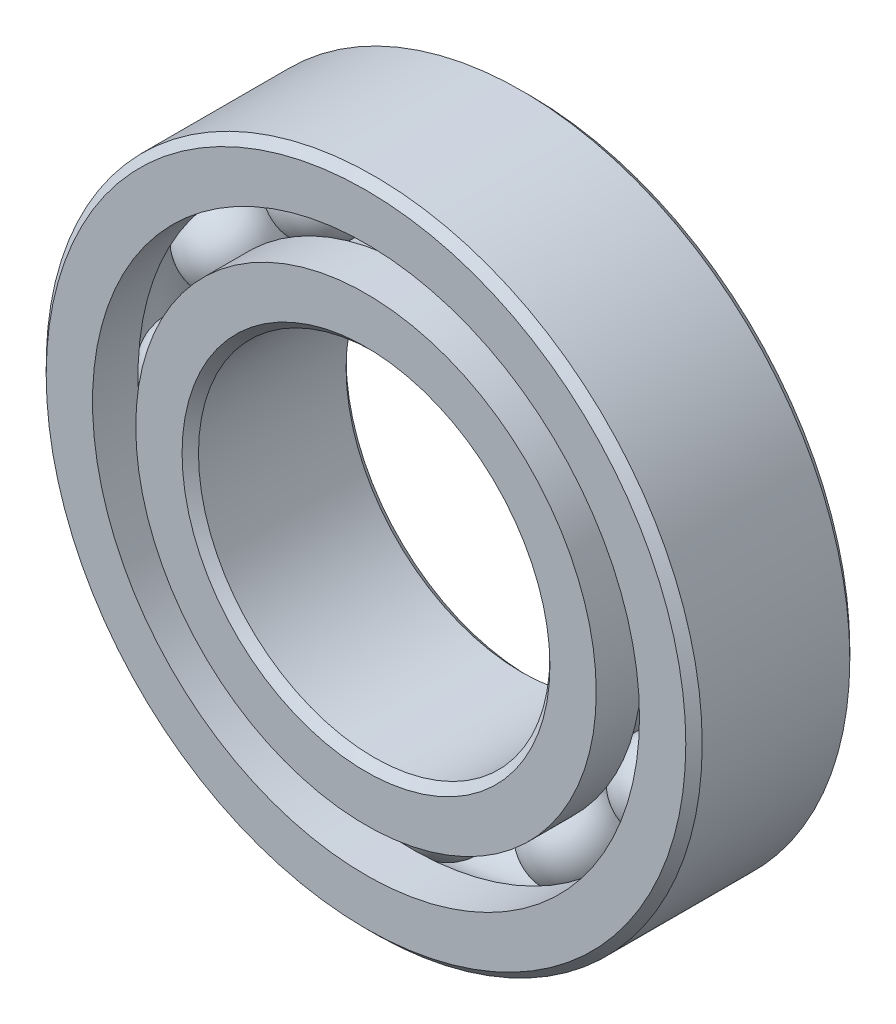
ISO-10303-21;
HEADER;
FILE_DESCRIPTION(('STEP AP214'),'2;1');
FILE_NAME('part.step','',(''),(''),'','','');
FILE_SCHEMA(('AUTOMOTIVE_DESIGN { 1 0 10303 214 1 1 1 1 }'));
ENDSEC;
DATA;
#1=APPLICATION_CONTEXT('core data for automotive mechanical design processes');
#2=APPLICATION_PROTOCOL_DEFINITION('international standard','automotive_design',2000,#1);
#3=PRODUCT_CONTEXT('',#1,'mechanical');
#4=PRODUCT('Part','Part','',(#3));
#5=PRODUCT_RELATED_PRODUCT_CATEGORY('part','',(#4));
#6=PRODUCT_DEFINITION_FORMATION('','',#4);
#7=PRODUCT_DEFINITION_CONTEXT('part definition',#1,'design');
#8=PRODUCT_DEFINITION('design','',#6,#7);
#9=PRODUCT_DEFINITION_SHAPE('','',#8);
#10=(LENGTH_UNIT() NAMED_UNIT(*) SI_UNIT(.MILLI.,.METRE.));
#11=(NAMED_UNIT(*) PLANE_ANGLE_UNIT() SI_UNIT($,.RADIAN.));
#12=(NAMED_UNIT(*) SI_UNIT($,.STERADIAN.) SOLID_ANGLE_UNIT());
#13=UNCERTAINTY_MEASURE_WITH_UNIT(LENGTH_MEASURE(1.E-05),#10,'distance_accuracy_value','');
#14=(GEOMETRIC_REPRESENTATION_CONTEXT(3) GLOBAL_UNCERTAINTY_ASSIGNED_CONTEXT((#13)) GLOBAL_UNIT_ASSIGNED_CONTEXT((#10,
#11,#12)) REPRESENTATION_CONTEXT('',''));
#15=CARTESIAN_POINT('',(0.,0.,0.));
#16=DIRECTION('',(0.,0.,1.));
#17=DIRECTION('',(1.,0.,0.));
#18=AXIS2_PLACEMENT_3D('',#15,#16,#17);
#19=CARTESIAN_POINT('',(-5.37499999999988,9.30977309068278,0.));
#20=DIRECTION('',(0.,0.,1.));
#21=DIRECTION('',(-0.499999999999989,0.866025403784445,0.));
#22=AXIS2_PLACEMENT_3D('',#19,#20,#21);
#23=SPHERICAL_SURFACE('',#22,1.80881842436904);
#24=CARTESIAN_POINT('',(-5.37499999999988,9.30977309068278,1.80881842436904));
#25=VERTEX_POINT('',#24);
#26=VERTEX_LOOP('',#25);
#27=FACE_BOUND('',#26,.T.);
#28=ADVANCED_FACE('F37',(#27),#23,.T.);
#29=CLOSED_SHELL('',(#28));
#30=MANIFOLD_SOLID_BREP('B2',#29);
#31=CARTESIAN_POINT('',(-9.30977309068265,5.37500000000011,0.));
#32=DIRECTION('',(0.,0.,1.));
#33=DIRECTION('',(-0.866025403784433,0.50000000000001,0.));
#34=AXIS2_PLACEMENT_3D('',#31,#32,#33);
#35=SPHERICAL_SURFACE('',#34,1.80881842436904);
#36=CARTESIAN_POINT('',(-9.30977309068265,5.37500000000011,1.80881842436904));
#37=VERTEX_POINT('',#36);
#38=VERTEX_LOOP('',#37);
#39=FACE_BOUND('',#38,.T.);
#40=ADVANCED_FACE('F57',(#39),#35,.T.);
#41=CLOSED_SHELL('',(#40));
#42=MANIFOLD_SOLID_BREP('B6',#41);
#43=CARTESIAN_POINT('',(-10.75,1.12600273177691E-13,0.));
#44=DIRECTION('',(0.,0.,1.));
#45=DIRECTION('',(-1.,0.,0.));
#46=AXIS2_PLACEMENT_3D('',#43,#44,#45);
#47=SPHERICAL_SURFACE('',#46,1.80881842436904);
#48=CARTESIAN_POINT('',(-10.75,1.12600273177691E-13,1.80881842436904));
#49=VERTEX_POINT('',#48);
#50=VERTEX_LOOP('',#49);
#51=FACE_BOUND('',#50,.T.);
#52=ADVANCED_FACE('F77',(#51),#47,.T.);
#53=CLOSED_SHELL('',(#52));
#54=MANIFOLD_SOLID_BREP('B33',#53);
#55=CARTESIAN_POINT('',(-9.30977309068276,-5.37499999999991,0.));
#56=DIRECTION('',(0.,0.,1.));
#57=DIRECTION('',(-0.866025403784443,-0.499999999999992,0.));
#58=AXIS2_PLACEMENT_3D('',#55,#56,#57);
#59=SPHERICAL_SURFACE('',#58,1.80881842436904);
#60=CARTESIAN_POINT('',(-9.30977309068276,-5.37499999999991,1.80881842436904));
#61=VERTEX_POINT('',#60);
#62=VERTEX_LOOP('',#61);
#63=FACE_BOUND('',#62,.T.);
#64=ADVANCED_FACE('F97',(#63),#59,.T.);
#65=CLOSED_SHELL('',(#64));
#66=MANIFOLD_SOLID_BREP('B53',#65);
#67=CARTESIAN_POINT('',(-5.37500000000008,-9.30977309068267,0.));
#68=DIRECTION('',(0.,0.,1.));
#69=DIRECTION('',(-0.500000000000007,-0.866025403784435,0.));
#70=AXIS2_PLACEMENT_3D('',#67,#68,#69);
#71=SPHERICAL_SURFACE('',#70,1.80881842436904);
#72=CARTESIAN_POINT('',(-5.37500000000008,-9.30977309068267,1.80881842436904));
#73=VERTEX_POINT('',#72);
#74=VERTEX_LOOP('',#73);
#75=FACE_BOUND('',#74,.T.);
#76=ADVANCED_FACE('F117',(#75),#71,.T.);
#77=CLOSED_SHELL('',(#76));
#78=MANIFOLD_SOLID_BREP('B73',#77);
#79=CARTESIAN_POINT('',(0.,-10.75,0.));
#80=DIRECTION('',(0.,0.,1.));
#81=DIRECTION('',(0.,-1.,0.));
#82=AXIS2_PLACEMENT_3D('',#79,#80,#81);
#83=SPHERICAL_SURFACE('',#82,1.80881842436904);
#84=CARTESIAN_POINT('',(0.,-10.75,1.80881842436904));
#85=VERTEX_POINT('',#84);
#86=VERTEX_LOOP('',#85);
#87=FACE_BOUND('',#86,.T.);
#88=ADVANCED_FACE('F137',(#87),#83,.T.);
#89=CLOSED_SHELL('',(#88));
#90=MANIFOLD_SOLID_BREP('B93',#89);
#91=CARTESIAN_POINT('',(5.37499999999994,-9.30977309068275,0.));
#92=DIRECTION('',(0.,0.,1.));
#93=DIRECTION('',(0.499999999999995,-0.866025403784442,0.));
#94=AXIS2_PLACEMENT_3D('',#91,#92,#93);
#95=SPHERICAL_SURFACE('',#94,1.80881842436904);
#96=CARTESIAN_POINT('',(5.37499999999994,-9.30977309068275,1.80881842436904));
#97=VERTEX_POINT('',#96);
#98=VERTEX_LOOP('',#97);
#99=FACE_BOUND('',#98,.T.);
#100=ADVANCED_FACE('F157',(#99),#95,.T.);
#101=CLOSED_SHELL('',(#100));
#102=MANIFOLD_SOLID_BREP('B113',#101);
#103=CARTESIAN_POINT('',(9.30977309068269,-5.37500000000004,0.));
#104=DIRECTION('',(0.,0.,1.));
#105=DIRECTION('',(0.866025403784436,-0.500000000000004,0.));
#106=AXIS2_PLACEMENT_3D('',#103,#104,#105);
#107=SPHERICAL_SURFACE('',#106,1.80881842436904);
#108=CARTESIAN_POINT('',(9.30977309068269,-5.37500000000004,1.80881842436904));
#109=VERTEX_POINT('',#108);
#110=VERTEX_LOOP('',#109);
#111=FACE_BOUND('',#110,.T.);
#112=ADVANCED_FACE('F177',(#111),#107,.T.);
#113=CLOSED_SHELL('',(#112));
#114=MANIFOLD_SOLID_BREP('B133',#113);
#115=CARTESIAN_POINT('',(10.75,0.,0.));
#116=DIRECTION('',(0.,0.,1.));
#117=DIRECTION('',(1.,0.,0.));
#118=AXIS2_PLACEMENT_3D('',#115,#116,#117);
#119=SPHERICAL_SURFACE('',#118,1.80881842436904);
#120=CARTESIAN_POINT('',(10.75,0.,1.80881842436904));
#121=VERTEX_POINT('',#120);
#122=VERTEX_LOOP('',#121);
#123=FACE_BOUND('',#122,.T.);
#124=ADVANCED_FACE('F197',(#123),#119,.T.);
#125=CLOSED_SHELL('',(#124));
#126=MANIFOLD_SOLID_BREP('B153',#125);
#127=CARTESIAN_POINT('',(9.30977309068273,5.37499999999998,0.));
#128=DIRECTION('',(0.,0.,1.));
#129=DIRECTION('',(0.86602540378444,0.499999999999998,0.));
#130=AXIS2_PLACEMENT_3D('',#127,#128,#129);
#131=SPHERICAL_SURFACE('',#130,1.80881842436904);
#132=CARTESIAN_POINT('',(9.30977309068273,5.37499999999998,1.80881842436904));
#133=VERTEX_POINT('',#132);
#134=VERTEX_LOOP('',#133);
#135=FACE_BOUND('',#134,.T.);
#136=ADVANCED_FACE('F217',(#135),#131,.T.);
#137=CLOSED_SHELL('',(#136));
#138=MANIFOLD_SOLID_BREP('B173',#137);
#139=CARTESIAN_POINT('',(5.37500000000001,9.30977309068271,0.));
#140=DIRECTION('',(0.,0.,1.));
#141=DIRECTION('',(0.500000000000001,0.866025403784438,0.));
#142=AXIS2_PLACEMENT_3D('',#139,#140,#141);
#143=SPHERICAL_SURFACE('',#142,1.80881842436904);
#144=CARTESIAN_POINT('',(5.37500000000001,9.30977309068271,1.80881842436904));
#145=VERTEX_POINT('',#144);
#146=VERTEX_LOOP('',#145);
#147=FACE_BOUND('',#146,.T.);
#148=ADVANCED_FACE('F237',(#147),#143,.T.);
#149=CLOSED_SHELL('',(#148));
#150=MANIFOLD_SOLID_BREP('B193',#149);
#151=CARTESIAN_POINT('',(0.,10.75,0.));
#152=DIRECTION('',(0.,0.,1.));
#153=DIRECTION('',(0.,1.,0.));
#154=AXIS2_PLACEMENT_3D('',#151,#152,#153);
#155=SPHERICAL_SURFACE('',#154,1.80881842436904);
#156=CARTESIAN_POINT('',(0.,10.75,1.80881842436904));
#157=VERTEX_POINT('',#156);
#158=VERTEX_LOOP('',#157);
#159=FACE_BOUND('',#158,.T.);
#160=ADVANCED_FACE('F259',(#159),#155,.T.);
#161=CLOSED_SHELL('',(#160));
#162=MANIFOLD_SOLID_BREP('B213',#161);
#163=CARTESIAN_POINT('',(0.,9.82692307692308,3.5));
#164=DIRECTION('',(0.,0.,-1.));
#165=DIRECTION('',(-1.,0.,0.));
#166=AXIS2_PLACEMENT_3D('',#163,#164,#165);
#167=PLANE('',#166);
#168=CARTESIAN_POINT('',(0.,0.,3.5));
#169=DIRECTION('',(0.,0.,1.));
#170=DIRECTION('',(1.,0.,0.));
#171=AXIS2_PLACEMENT_3D('',#168,#169,#170);
#172=CIRCLE('',#171,7.85);
#173=CARTESIAN_POINT('',(7.85,0.,3.5));
#174=VERTEX_POINT('',#173);
#175=EDGE_CURVE('E306',#174,#174,#172,.T.);
#176=ORIENTED_EDGE('',*,*,#175,.F.);
#177=EDGE_LOOP('',(#176));
#178=FACE_BOUND('',#177,.T.);
#179=CARTESIAN_POINT('',(0.,0.,3.5));
#180=DIRECTION('',(0.,0.,1.));
#181=DIRECTION('',(1.,0.,0.));
#182=AXIS2_PLACEMENT_3D('',#179,#180,#181);
#183=CIRCLE('',#182,9.82692307692308);
#184=CARTESIAN_POINT('',(9.82692307692308,0.,3.5));
#185=VERTEX_POINT('',#184);
#186=EDGE_CURVE('E258',#185,#185,#183,.T.);
#187=ORIENTED_EDGE('',*,*,#186,.T.);
#188=EDGE_LOOP('',(#187));
#189=FACE_BOUND('',#188,.T.);
#190=ADVANCED_FACE('F278',(#178,#189),#167,.F.);
#191=CARTESIAN_POINT('',(0.,0.,3.5));
#192=DIRECTION('',(0.,0.,1.));
#193=DIRECTION('',(1.,0.,0.));
#194=AXIS2_PLACEMENT_3D('',#191,#192,#193);
#195=CYLINDRICAL_SURFACE('',#194,9.82692307692308);
#196=ORIENTED_EDGE('',*,*,#186,.F.);
#197=EDGE_LOOP('',(#196));
#198=FACE_BOUND('',#197,.T.);
#199=CARTESIAN_POINT('',(0.,0.,1.55555555555556));
#200=DIRECTION('',(0.,0.,1.));
#201=DIRECTION('',(1.,0.,0.));
#202=AXIS2_PLACEMENT_3D('',#199,#200,#201);
#203=CIRCLE('',#202,9.82692307692308);
#204=CARTESIAN_POINT('',(9.82692307692308,0.,1.55555555555556));
#205=VERTEX_POINT('',#204);
#206=EDGE_CURVE('E284',#205,#205,#203,.T.);
#207=ORIENTED_EDGE('',*,*,#206,.T.);
#208=EDGE_LOOP('',(#207));
#209=FACE_BOUND('',#208,.T.);
#210=ADVANCED_FACE('F313',(#198,#209),#195,.T.);
#211=CARTESIAN_POINT('',(0.,0.,0.));
#212=DIRECTION('',(0.,0.,1.));
#213=DIRECTION('',(1.,0.,0.));
#214=AXIS2_PLACEMENT_3D('',#211,#212,#213);
#215=TOROIDAL_SURFACE('',#214,10.75,1.80881842436904);
#216=ORIENTED_EDGE('',*,*,#206,.F.);
#217=EDGE_LOOP('',(#216));
#218=FACE_BOUND('',#217,.T.);
#219=CARTESIAN_POINT('',(0.,0.,-1.55555555555556));
#220=DIRECTION('',(0.,0.,1.));
#221=DIRECTION('',(1.,0.,0.));
#222=AXIS2_PLACEMENT_3D('',#219,#220,#221);
#223=CIRCLE('',#222,9.82692307692308);
#224=CARTESIAN_POINT('',(9.82692307692308,0.,-1.55555555555556));
#225=VERTEX_POINT('',#224);
#226=EDGE_CURVE('E288',#225,#225,#223,.T.);
#227=ORIENTED_EDGE('',*,*,#226,.T.);
#228=EDGE_LOOP('',(#227));
#229=FACE_BOUND('',#228,.T.);
#230=ADVANCED_FACE('F317',(#218,#229),#215,.F.);
#231=CARTESIAN_POINT('',(0.,0.,3.5));
#232=DIRECTION('',(0.,0.,1.));
#233=DIRECTION('',(1.,0.,0.));
#234=AXIS2_PLACEMENT_3D('',#231,#232,#233);
#235=CYLINDRICAL_SURFACE('',#234,9.82692307692308);
#236=ORIENTED_EDGE('',*,*,#226,.F.);
#237=EDGE_LOOP('',(#236));
#238=FACE_BOUND('',#237,.T.);
#239=CARTESIAN_POINT('',(0.,0.,-3.5));
#240=DIRECTION('',(0.,0.,1.));
#241=DIRECTION('',(1.,0.,0.));
#242=AXIS2_PLACEMENT_3D('',#239,#240,#241);
#243=CIRCLE('',#242,9.82692307692308);
#244=CARTESIAN_POINT('',(9.82692307692308,0.,-3.5));
#245=VERTEX_POINT('',#244);
#246=EDGE_CURVE('E292',#245,#245,#243,.T.);
#247=ORIENTED_EDGE('',*,*,#246,.T.);
#248=EDGE_LOOP('',(#247));
#249=FACE_BOUND('',#248,.T.);
#250=ADVANCED_FACE('F322',(#238,#249),#235,.T.);
#251=CARTESIAN_POINT('',(0.,7.85,-3.5));
#252=DIRECTION('',(0.,0.,1.));
#253=DIRECTION('',(1.,0.,0.));
#254=AXIS2_PLACEMENT_3D('',#251,#252,#253);
#255=PLANE('',#254);
#256=ORIENTED_EDGE('',*,*,#246,.F.);
#257=EDGE_LOOP('',(#256));
#258=FACE_BOUND('',#257,.T.);
#259=CARTESIAN_POINT('',(0.,0.,-3.5));
#260=DIRECTION('',(0.,0.,1.));
#261=DIRECTION('',(1.,0.,0.));
#262=AXIS2_PLACEMENT_3D('',#259,#260,#261);
#263=CIRCLE('',#262,7.85);
#264=CARTESIAN_POINT('',(7.85,0.,-3.5));
#265=VERTEX_POINT('',#264);
#266=EDGE_CURVE('E297',#265,#265,#263,.T.);
#267=ORIENTED_EDGE('',*,*,#266,.T.);
#268=EDGE_LOOP('',(#267));
#269=FACE_BOUND('',#268,.T.);
#270=ADVANCED_FACE('F328',(#258,#269),#255,.F.);
#271=CARTESIAN_POINT('',(0.,0.,-3.15));
#272=DIRECTION('',(0.,0.,-1.));
#273=DIRECTION('',(-1.,0.,0.));
#274=AXIS2_PLACEMENT_3D('',#271,#272,#273);
#275=CONICAL_SURFACE('',#274,7.5,0.785398163397437);
#276=ORIENTED_EDGE('',*,*,#266,.F.);
#277=EDGE_LOOP('',(#276));
#278=FACE_BOUND('',#277,.T.);
#279=CARTESIAN_POINT('',(0.,0.,-3.15));
#280=DIRECTION('',(0.,0.,1.));
#281=DIRECTION('',(1.,0.,0.));
#282=AXIS2_PLACEMENT_3D('',#279,#280,#281);
#283=CIRCLE('',#282,7.5);
#284=CARTESIAN_POINT('',(7.5,0.,-3.15));
#285=VERTEX_POINT('',#284);
#286=EDGE_CURVE('E300',#285,#285,#283,.T.);
#287=ORIENTED_EDGE('',*,*,#286,.T.);
#288=EDGE_LOOP('',(#287));
#289=FACE_BOUND('',#288,.T.);
#290=ADVANCED_FACE('F332',(#278,#289),#275,.F.);
#291=CARTESIAN_POINT('',(0.,0.,3.5));
#292=DIRECTION('',(0.,0.,1.));
#293=DIRECTION('',(1.,0.,0.));
#294=AXIS2_PLACEMENT_3D('',#291,#292,#293);
#295=CYLINDRICAL_SURFACE('',#294,7.5);
#296=ORIENTED_EDGE('',*,*,#286,.F.);
#297=EDGE_LOOP('',(#296));
#298=FACE_BOUND('',#297,.T.);
#299=CARTESIAN_POINT('',(0.,0.,3.15000000000001));
#300=DIRECTION('',(0.,0.,1.));
#301=DIRECTION('',(1.,0.,0.));
#302=AXIS2_PLACEMENT_3D('',#299,#300,#301);
#303=CIRCLE('',#302,7.5);
#304=CARTESIAN_POINT('',(7.5,0.,3.15000000000001));
#305=VERTEX_POINT('',#304);
#306=EDGE_CURVE('E303',#305,#305,#303,.T.);
#307=ORIENTED_EDGE('',*,*,#306,.T.);
#308=EDGE_LOOP('',(#307));
#309=FACE_BOUND('',#308,.T.);
#310=ADVANCED_FACE('F336',(#298,#309),#295,.F.);
#311=CARTESIAN_POINT('',(0.,0.,3.5));
#312=DIRECTION('',(0.,0.,1.));
#313=DIRECTION('',(1.,0.,0.));
#314=AXIS2_PLACEMENT_3D('',#311,#312,#313);
#315=CONICAL_SURFACE('',#314,7.85,0.785398163397456);
#316=ORIENTED_EDGE('',*,*,#306,.F.);
#317=EDGE_LOOP('',(#316));
#318=FACE_BOUND('',#317,.T.);
#319=ORIENTED_EDGE('',*,*,#175,.T.);
#320=EDGE_LOOP('',(#319));
#321=FACE_BOUND('',#320,.T.);
#322=ADVANCED_FACE('F310',(#318,#321),#315,.F.);
#323=CLOSED_SHELL('',(#190,#210,#230,#250,#270,#290,#310,#322));
#324=MANIFOLD_SOLID_BREP('B233',#323);
#325=CARTESIAN_POINT('',(0.,0.,3.15));
#326=DIRECTION('',(0.,0.,-1.));
#327=DIRECTION('',(-1.,0.,0.));
#328=AXIS2_PLACEMENT_3D('',#325,#326,#327);
#329=CONICAL_SURFACE('',#328,14.,0.785398163397445);
#330=CARTESIAN_POINT('',(0.,0.,3.5));
#331=DIRECTION('',(0.,0.,1.));
#332=DIRECTION('',(1.,0.,0.));
#333=AXIS2_PLACEMENT_3D('',#330,#331,#332);
#334=CIRCLE('',#333,13.65);
#335=CARTESIAN_POINT('',(13.65,0.,3.5));
#336=VERTEX_POINT('',#335);
#337=EDGE_CURVE('E427',#336,#336,#334,.T.);
#338=ORIENTED_EDGE('',*,*,#337,.F.);
#339=EDGE_LOOP('',(#338));
#340=FACE_BOUND('',#339,.T.);
#341=CARTESIAN_POINT('',(0.,0.,3.15));
#342=DIRECTION('',(0.,0.,1.));
#343=DIRECTION('',(1.,0.,0.));
#344=AXIS2_PLACEMENT_3D('',#341,#342,#343);
#345=CIRCLE('',#344,14.);
#346=CARTESIAN_POINT('',(14.,0.,3.15));
#347=VERTEX_POINT('',#346);
#348=EDGE_CURVE('E277',#347,#347,#345,.T.);
#349=ORIENTED_EDGE('',*,*,#348,.T.);
#350=EDGE_LOOP('',(#349));
#351=FACE_BOUND('',#350,.T.);
#352=ADVANCED_FACE('F399',(#340,#351),#329,.T.);
#353=CARTESIAN_POINT('',(0.,0.,3.5));
#354=DIRECTION('',(0.,0.,1.));
#355=DIRECTION('',(1.,0.,0.));
#356=AXIS2_PLACEMENT_3D('',#353,#354,#355);
#357=CYLINDRICAL_SURFACE('',#356,14.);
#358=ORIENTED_EDGE('',*,*,#348,.F.);
#359=EDGE_LOOP('',(#358));
#360=FACE_BOUND('',#359,.T.);
#361=CARTESIAN_POINT('',(0.,0.,-3.15));
#362=DIRECTION('',(0.,0.,1.));
#363=DIRECTION('',(1.,0.,0.));
#364=AXIS2_PLACEMENT_3D('',#361,#362,#363);
#365=CIRCLE('',#364,14.);
#366=CARTESIAN_POINT('',(14.,0.,-3.15));
#367=VERTEX_POINT('',#366);
#368=EDGE_CURVE('E405',#367,#367,#365,.T.);
#369=ORIENTED_EDGE('',*,*,#368,.T.);
#370=EDGE_LOOP('',(#369));
#371=FACE_BOUND('',#370,.T.);
#372=ADVANCED_FACE('F434',(#360,#371),#357,.T.);
#373=CARTESIAN_POINT('',(0.,0.,-3.5));
#374=DIRECTION('',(0.,0.,1.));
#375=DIRECTION('',(1.,0.,0.));
#376=AXIS2_PLACEMENT_3D('',#373,#374,#375);
#377=CONICAL_SURFACE('',#376,13.65,0.785398163397445);
#378=ORIENTED_EDGE('',*,*,#368,.F.);
#379=EDGE_LOOP('',(#378));
#380=FACE_BOUND('',#379,.T.);
#381=CARTESIAN_POINT('',(0.,0.,-3.5));
#382=DIRECTION('',(0.,0.,1.));
#383=DIRECTION('',(1.,0.,0.));
#384=AXIS2_PLACEMENT_3D('',#381,#382,#383);
#385=CIRCLE('',#384,13.65);
#386=CARTESIAN_POINT('',(13.65,0.,-3.5));
#387=VERTEX_POINT('',#386);
#388=EDGE_CURVE('E409',#387,#387,#385,.T.);
#389=ORIENTED_EDGE('',*,*,#388,.T.);
#390=EDGE_LOOP('',(#389));
#391=FACE_BOUND('',#390,.T.);
#392=ADVANCED_FACE('F438',(#380,#391),#377,.T.);
#393=CARTESIAN_POINT('',(0.,13.65,-3.5));
#394=DIRECTION('',(0.,0.,1.));
#395=DIRECTION('',(1.,0.,0.));
#396=AXIS2_PLACEMENT_3D('',#393,#394,#395);
#397=PLANE('',#396);
#398=ORIENTED_EDGE('',*,*,#388,.F.);
#399=EDGE_LOOP('',(#398));
#400=FACE_BOUND('',#399,.T.);
#401=CARTESIAN_POINT('',(0.,0.,-3.5));
#402=DIRECTION('',(0.,0.,1.));
#403=DIRECTION('',(1.,0.,0.));
#404=AXIS2_PLACEMENT_3D('',#401,#402,#403);
#405=CIRCLE('',#404,11.6730769230769);
#406=CARTESIAN_POINT('',(11.6730769230769,0.,-3.5));
#407=VERTEX_POINT('',#406);
#408=EDGE_CURVE('E413',#407,#407,#405,.T.);
#409=ORIENTED_EDGE('',*,*,#408,.T.);
#410=EDGE_LOOP('',(#409));
#411=FACE_BOUND('',#410,.T.);
#412=ADVANCED_FACE('F443',(#400,#411),#397,.F.);
#413=CARTESIAN_POINT('',(0.,0.,3.5));
#414=DIRECTION('',(0.,0.,1.));
#415=DIRECTION('',(1.,0.,0.));
#416=AXIS2_PLACEMENT_3D('',#413,#414,#415);
#417=CYLINDRICAL_SURFACE('',#416,11.6730769230769);
#418=ORIENTED_EDGE('',*,*,#408,.F.);
#419=EDGE_LOOP('',(#418));
#420=FACE_BOUND('',#419,.T.);
#421=CARTESIAN_POINT('',(0.,0.,-1.55555555555556));
#422=DIRECTION('',(0.,0.,1.));
#423=DIRECTION('',(1.,0.,0.));
#424=AXIS2_PLACEMENT_3D('',#421,#422,#423);
#425=CIRCLE('',#424,11.6730769230769);
#426=CARTESIAN_POINT('',(11.6730769230769,0.,-1.55555555555556));
#427=VERTEX_POINT('',#426);
#428=EDGE_CURVE('E418',#427,#427,#425,.T.);
#429=ORIENTED_EDGE('',*,*,#428,.T.);
#430=EDGE_LOOP('',(#429));
#431=FACE_BOUND('',#430,.T.);
#432=ADVANCED_FACE('F449',(#420,#431),#417,.F.);
#433=CARTESIAN_POINT('',(0.,0.,0.));
#434=DIRECTION('',(0.,0.,1.));
#435=DIRECTION('',(1.,0.,0.));
#436=AXIS2_PLACEMENT_3D('',#433,#434,#435);
#437=TOROIDAL_SURFACE('',#436,10.75,1.80881842436904);
#438=ORIENTED_EDGE('',*,*,#428,.F.);
#439=EDGE_LOOP('',(#438));
#440=FACE_BOUND('',#439,.T.);
#441=CARTESIAN_POINT('',(0.,0.,1.55555555555556));
#442=DIRECTION('',(0.,0.,1.));
#443=DIRECTION('',(1.,0.,0.));
#444=AXIS2_PLACEMENT_3D('',#441,#442,#443);
#445=CIRCLE('',#444,11.6730769230769);
#446=CARTESIAN_POINT('',(11.6730769230769,0.,1.55555555555556));
#447=VERTEX_POINT('',#446);
#448=EDGE_CURVE('E421',#447,#447,#445,.T.);
#449=ORIENTED_EDGE('',*,*,#448,.T.);
#450=EDGE_LOOP('',(#449));
#451=FACE_BOUND('',#450,.T.);
#452=ADVANCED_FACE('F453',(#440,#451),#437,.F.);
#453=CARTESIAN_POINT('',(0.,0.,3.5));
#454=DIRECTION('',(0.,0.,1.));
#455=DIRECTION('',(1.,0.,0.));
#456=AXIS2_PLACEMENT_3D('',#453,#454,#455);
#457=CYLINDRICAL_SURFACE('',#456,11.6730769230769);
#458=ORIENTED_EDGE('',*,*,#448,.F.);
#459=EDGE_LOOP('',(#458));
#460=FACE_BOUND('',#459,.T.);
#461=CARTESIAN_POINT('',(0.,0.,3.5));
#462=DIRECTION('',(0.,0.,1.));
#463=DIRECTION('',(1.,0.,0.));
#464=AXIS2_PLACEMENT_3D('',#461,#462,#463);
#465=CIRCLE('',#464,11.6730769230769);
#466=CARTESIAN_POINT('',(11.6730769230769,0.,3.5));
#467=VERTEX_POINT('',#466);
#468=EDGE_CURVE('E424',#467,#467,#465,.T.);
#469=ORIENTED_EDGE('',*,*,#468,.T.);
#470=EDGE_LOOP('',(#469));
#471=FACE_BOUND('',#470,.T.);
#472=ADVANCED_FACE('F457',(#460,#471),#457,.F.);
#473=CARTESIAN_POINT('',(0.,13.65,3.5));
#474=DIRECTION('',(0.,0.,-1.));
#475=DIRECTION('',(-1.,0.,0.));
#476=AXIS2_PLACEMENT_3D('',#473,#474,#475);
#477=PLANE('',#476);
#478=ORIENTED_EDGE('',*,*,#468,.F.);
#479=EDGE_LOOP('',(#478));
#480=FACE_BOUND('',#479,.T.);
#481=ORIENTED_EDGE('',*,*,#337,.T.);
#482=EDGE_LOOP('',(#481));
#483=FACE_BOUND('',#482,.T.);
#484=ADVANCED_FACE('F431',(#480,#483),#477,.F.);
#485=CLOSED_SHELL('',(#352,#372,#392,#412,#432,#452,#472,#484));
#486=MANIFOLD_SOLID_BREP('B253',#485);
#487=ADVANCED_BREP_SHAPE_REPRESENTATION('',(#18,#30,#42,#54,#66,#78,#90,#102,#114,#126,#138,
#150,#162,#324,#486),#14);
#488=SHAPE_DEFINITION_REPRESENTATION(#9,#487);
ENDSEC;
END-ISO-10303-21;
